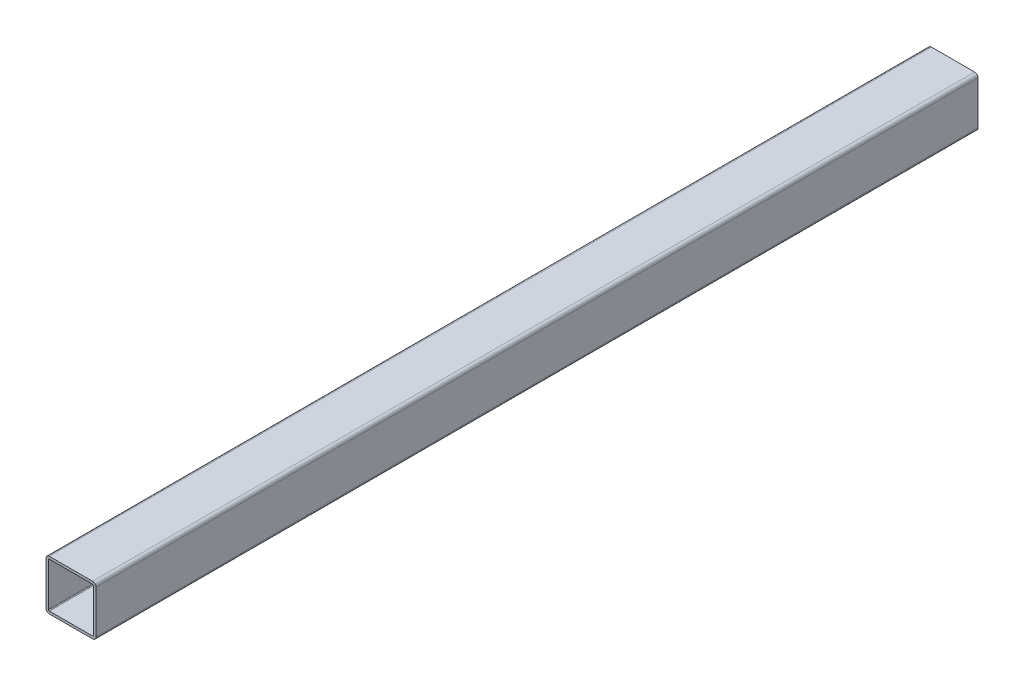
ISO-10303-21;
HEADER;
FILE_DESCRIPTION(('STEP AP214'),'2;1');
FILE_NAME('part.step','',(''),(''),'','','');
FILE_SCHEMA(('AUTOMOTIVE_DESIGN { 1 0 10303 214 1 1 1 1 }'));
ENDSEC;
DATA;
#1=APPLICATION_CONTEXT('core data for automotive mechanical design processes');
#2=APPLICATION_PROTOCOL_DEFINITION('international standard','automotive_design',2000,#1);
#3=PRODUCT_CONTEXT('',#1,'mechanical');
#4=PRODUCT('Part','Part','',(#3));
#5=PRODUCT_RELATED_PRODUCT_CATEGORY('part','',(#4));
#6=PRODUCT_DEFINITION_FORMATION('','',#4);
#7=PRODUCT_DEFINITION_CONTEXT('part definition',#1,'design');
#8=PRODUCT_DEFINITION('design','',#6,#7);
#9=PRODUCT_DEFINITION_SHAPE('','',#8);
#10=(LENGTH_UNIT() NAMED_UNIT(*) SI_UNIT(.MILLI.,.METRE.));
#11=(NAMED_UNIT(*) PLANE_ANGLE_UNIT() SI_UNIT($,.RADIAN.));
#12=(NAMED_UNIT(*) SI_UNIT($,.STERADIAN.) SOLID_ANGLE_UNIT());
#13=UNCERTAINTY_MEASURE_WITH_UNIT(LENGTH_MEASURE(1.E-05),#10,'distance_accuracy_value','');
#14=(GEOMETRIC_REPRESENTATION_CONTEXT(3) GLOBAL_UNCERTAINTY_ASSIGNED_CONTEXT((#13)) GLOBAL_UNIT_ASSIGNED_CONTEXT((#10,
#11,#12)) REPRESENTATION_CONTEXT('',''));
#15=CARTESIAN_POINT('',(0.,0.,0.));
#16=DIRECTION('',(0.,0.,1.));
#17=DIRECTION('',(1.,0.,0.));
#18=AXIS2_PLACEMENT_3D('',#15,#16,#17);
#19=CARTESIAN_POINT('',(2.,2.,530.));
#20=DIRECTION('',(0.,0.,1.));
#21=DIRECTION('',(1.,0.,0.));
#22=AXIS2_PLACEMENT_3D('',#19,#20,#21);
#23=PLANE('',#22);
#24=CARTESIAN_POINT('',(2.,2.,530.));
#25=DIRECTION('',(0.,0.,1.));
#26=DIRECTION('',(1.,0.,0.));
#27=AXIS2_PLACEMENT_3D('',#24,#25,#26);
#28=CIRCLE('',#27,2.);
#29=CARTESIAN_POINT('',(0.,2.00000000000001,530.));
#30=VERTEX_POINT('',#29);
#31=CARTESIAN_POINT('',(2.00000000000001,0.,530.));
#32=VERTEX_POINT('',#31);
#33=EDGE_CURVE('E263',#30,#32,#28,.T.);
#34=ORIENTED_EDGE('',*,*,#33,.T.);
#35=DIRECTION('',(1.,0.,0.));
#36=VECTOR('',#35,1.);
#37=CARTESIAN_POINT('',(2.00000000000001,0.,530.));
#38=LINE('',#37,#36);
#39=CARTESIAN_POINT('',(28.,0.,530.));
#40=VERTEX_POINT('',#39);
#41=EDGE_CURVE('E266',#32,#40,#38,.T.);
#42=ORIENTED_EDGE('',*,*,#41,.T.);
#43=CARTESIAN_POINT('',(28.,2.,530.));
#44=DIRECTION('',(0.,0.,1.));
#45=DIRECTION('',(-1.,0.,0.));
#46=AXIS2_PLACEMENT_3D('',#43,#44,#45);
#47=CIRCLE('',#46,2.);
#48=CARTESIAN_POINT('',(30.,2.00000000000001,530.));
#49=VERTEX_POINT('',#48);
#50=EDGE_CURVE('E269',#40,#49,#47,.T.);
#51=ORIENTED_EDGE('',*,*,#50,.T.);
#52=DIRECTION('',(0.,1.,0.));
#53=VECTOR('',#52,1.);
#54=CARTESIAN_POINT('',(30.,2.00000000000001,530.));
#55=LINE('',#54,#53);
#56=CARTESIAN_POINT('',(30.,28.,530.));
#57=VERTEX_POINT('',#56);
#58=EDGE_CURVE('E271',#49,#57,#55,.T.);
#59=ORIENTED_EDGE('',*,*,#58,.T.);
#60=CARTESIAN_POINT('',(28.,28.,530.));
#61=DIRECTION('',(0.,0.,1.));
#62=DIRECTION('',(-1.,0.,0.));
#63=AXIS2_PLACEMENT_3D('',#60,#61,#62);
#64=CIRCLE('',#63,2.);
#65=CARTESIAN_POINT('',(28.,30.,530.));
#66=VERTEX_POINT('',#65);
#67=EDGE_CURVE('E273',#57,#66,#64,.T.);
#68=ORIENTED_EDGE('',*,*,#67,.T.);
#69=DIRECTION('',(-1.,0.,0.));
#70=VECTOR('',#69,1.);
#71=CARTESIAN_POINT('',(2.00000000000001,30.,530.));
#72=LINE('',#71,#70);
#73=CARTESIAN_POINT('',(2.00000000000001,30.,530.));
#74=VERTEX_POINT('',#73);
#75=EDGE_CURVE('E275',#66,#74,#72,.T.);
#76=ORIENTED_EDGE('',*,*,#75,.T.);
#77=CARTESIAN_POINT('',(2.,28.,530.));
#78=DIRECTION('',(0.,0.,1.));
#79=DIRECTION('',(1.,0.,0.));
#80=AXIS2_PLACEMENT_3D('',#77,#78,#79);
#81=CIRCLE('',#80,2.);
#82=CARTESIAN_POINT('',(0.,28.,530.));
#83=VERTEX_POINT('',#82);
#84=EDGE_CURVE('E277',#74,#83,#81,.T.);
#85=ORIENTED_EDGE('',*,*,#84,.T.);
#86=DIRECTION('',(0.,-1.,0.));
#87=VECTOR('',#86,1.);
#88=CARTESIAN_POINT('',(0.,2.00000000000001,530.));
#89=LINE('',#88,#87);
#90=EDGE_CURVE('E279',#83,#30,#89,.T.);
#91=ORIENTED_EDGE('',*,*,#90,.T.);
#92=EDGE_LOOP('',(#34,#42,#51,#59,#68,#76,#85,#91));
#93=FACE_BOUND('',#92,.T.);
#94=DIRECTION('',(1.,0.,0.));
#95=VECTOR('',#94,1.);
#96=CARTESIAN_POINT('',(2.00000000000001,1.5,530.));
#97=LINE('',#96,#95);
#98=CARTESIAN_POINT('',(2.00000000000001,1.5,530.));
#99=VERTEX_POINT('',#98);
#100=CARTESIAN_POINT('',(28.,1.5,530.));
#101=VERTEX_POINT('',#100);
#102=EDGE_CURVE('E206',#99,#101,#97,.T.);
#103=ORIENTED_EDGE('',*,*,#102,.F.);
#104=CARTESIAN_POINT('',(2.,2.,530.));
#105=DIRECTION('',(0.,0.,1.));
#106=DIRECTION('',(1.,0.,0.));
#107=AXIS2_PLACEMENT_3D('',#104,#105,#106);
#108=CIRCLE('',#107,0.5);
#109=CARTESIAN_POINT('',(1.5,2.00000000000001,530.));
#110=VERTEX_POINT('',#109);
#111=EDGE_CURVE('E198',#110,#99,#108,.T.);
#112=ORIENTED_EDGE('',*,*,#111,.F.);
#113=DIRECTION('',(0.,-1.,0.));
#114=VECTOR('',#113,1.);
#115=CARTESIAN_POINT('',(1.5,2.00000000000001,530.));
#116=LINE('',#115,#114);
#117=CARTESIAN_POINT('',(1.5,28.,530.));
#118=VERTEX_POINT('',#117);
#119=EDGE_CURVE('E231',#118,#110,#116,.T.);
#120=ORIENTED_EDGE('',*,*,#119,.F.);
#121=CARTESIAN_POINT('',(2.,28.,530.));
#122=DIRECTION('',(0.,0.,1.));
#123=DIRECTION('',(1.,0.,0.));
#124=AXIS2_PLACEMENT_3D('',#121,#122,#123);
#125=CIRCLE('',#124,0.500000000000001);
#126=CARTESIAN_POINT('',(2.00000000000001,28.5,530.));
#127=VERTEX_POINT('',#126);
#128=EDGE_CURVE('E229',#127,#118,#125,.T.);
#129=ORIENTED_EDGE('',*,*,#128,.F.);
#130=DIRECTION('',(-1.,0.,0.));
#131=VECTOR('',#130,1.);
#132=CARTESIAN_POINT('',(2.00000000000001,28.5,530.));
#133=LINE('',#132,#131);
#134=CARTESIAN_POINT('',(28.,28.5,530.));
#135=VERTEX_POINT('',#134);
#136=EDGE_CURVE('E227',#135,#127,#133,.T.);
#137=ORIENTED_EDGE('',*,*,#136,.F.);
#138=CARTESIAN_POINT('',(28.,28.,530.));
#139=DIRECTION('',(0.,0.,1.));
#140=DIRECTION('',(1.,0.,0.));
#141=AXIS2_PLACEMENT_3D('',#138,#139,#140);
#142=CIRCLE('',#141,0.500000000000002);
#143=CARTESIAN_POINT('',(28.5,28.,530.));
#144=VERTEX_POINT('',#143);
#145=EDGE_CURVE('E225',#144,#135,#142,.T.);
#146=ORIENTED_EDGE('',*,*,#145,.F.);
#147=DIRECTION('',(0.,1.,0.));
#148=VECTOR('',#147,1.);
#149=CARTESIAN_POINT('',(28.5,2.00000000000001,530.));
#150=LINE('',#149,#148);
#151=CARTESIAN_POINT('',(28.5,2.,530.));
#152=VERTEX_POINT('',#151);
#153=EDGE_CURVE('E221',#152,#144,#150,.T.);
#154=ORIENTED_EDGE('',*,*,#153,.F.);
#155=CARTESIAN_POINT('',(28.,2.,530.));
#156=DIRECTION('',(0.,0.,1.));
#157=DIRECTION('',(1.,0.,0.));
#158=AXIS2_PLACEMENT_3D('',#155,#156,#157);
#159=CIRCLE('',#158,0.500000000000001);
#160=EDGE_CURVE('E219',#101,#152,#159,.T.);
#161=ORIENTED_EDGE('',*,*,#160,.F.);
#162=EDGE_LOOP('',(#103,#112,#120,#129,#137,#146,#154,#161));
#163=FACE_BOUND('',#162,.T.);
#164=ADVANCED_FACE('F85',(#93,#163),#23,.T.);
#165=CARTESIAN_POINT('',(2.,2.,0.));
#166=DIRECTION('',(0.,0.,1.));
#167=DIRECTION('',(1.,0.,0.));
#168=AXIS2_PLACEMENT_3D('',#165,#166,#167);
#169=PLANE('',#168);
#170=CARTESIAN_POINT('',(2.,2.,0.));
#171=DIRECTION('',(0.,0.,1.));
#172=DIRECTION('',(1.,0.,0.));
#173=AXIS2_PLACEMENT_3D('',#170,#171,#172);
#174=CIRCLE('',#173,2.);
#175=CARTESIAN_POINT('',(0.,2.00000000000001,0.));
#176=VERTEX_POINT('',#175);
#177=CARTESIAN_POINT('',(2.00000000000001,0.,0.));
#178=VERTEX_POINT('',#177);
#179=EDGE_CURVE('E214',#176,#178,#174,.T.);
#180=ORIENTED_EDGE('',*,*,#179,.F.);
#181=DIRECTION('',(0.,-1.,0.));
#182=VECTOR('',#181,1.);
#183=CARTESIAN_POINT('',(0.,2.00000000000001,0.));
#184=LINE('',#183,#182);
#185=CARTESIAN_POINT('',(0.,28.,0.));
#186=VERTEX_POINT('',#185);
#187=EDGE_CURVE('E267',#186,#176,#184,.T.);
#188=ORIENTED_EDGE('',*,*,#187,.F.);
#189=CARTESIAN_POINT('',(2.,28.,0.));
#190=DIRECTION('',(0.,0.,1.));
#191=DIRECTION('',(1.,0.,0.));
#192=AXIS2_PLACEMENT_3D('',#189,#190,#191);
#193=CIRCLE('',#192,2.);
#194=CARTESIAN_POINT('',(2.00000000000001,30.,0.));
#195=VERTEX_POINT('',#194);
#196=EDGE_CURVE('E294',#195,#186,#193,.T.);
#197=ORIENTED_EDGE('',*,*,#196,.F.);
#198=DIRECTION('',(-1.,0.,0.));
#199=VECTOR('',#198,1.);
#200=CARTESIAN_POINT('',(2.00000000000001,30.,0.));
#201=LINE('',#200,#199);
#202=CARTESIAN_POINT('',(28.,30.,0.));
#203=VERTEX_POINT('',#202);
#204=EDGE_CURVE('E292',#203,#195,#201,.T.);
#205=ORIENTED_EDGE('',*,*,#204,.F.);
#206=CARTESIAN_POINT('',(28.,28.,0.));
#207=DIRECTION('',(0.,0.,1.));
#208=DIRECTION('',(-1.,0.,0.));
#209=AXIS2_PLACEMENT_3D('',#206,#207,#208);
#210=CIRCLE('',#209,2.);
#211=CARTESIAN_POINT('',(30.,28.,0.));
#212=VERTEX_POINT('',#211);
#213=EDGE_CURVE('E290',#212,#203,#210,.T.);
#214=ORIENTED_EDGE('',*,*,#213,.F.);
#215=DIRECTION('',(0.,1.,0.));
#216=VECTOR('',#215,1.);
#217=CARTESIAN_POINT('',(30.,2.00000000000001,0.));
#218=LINE('',#217,#216);
#219=CARTESIAN_POINT('',(30.,2.00000000000001,0.));
#220=VERTEX_POINT('',#219);
#221=EDGE_CURVE('E288',#220,#212,#218,.T.);
#222=ORIENTED_EDGE('',*,*,#221,.F.);
#223=CARTESIAN_POINT('',(28.,2.,0.));
#224=DIRECTION('',(0.,0.,1.));
#225=DIRECTION('',(-1.,0.,0.));
#226=AXIS2_PLACEMENT_3D('',#223,#224,#225);
#227=CIRCLE('',#226,2.);
#228=CARTESIAN_POINT('',(28.,0.,0.));
#229=VERTEX_POINT('',#228);
#230=EDGE_CURVE('E286',#229,#220,#227,.T.);
#231=ORIENTED_EDGE('',*,*,#230,.F.);
#232=DIRECTION('',(1.,0.,0.));
#233=VECTOR('',#232,1.);
#234=CARTESIAN_POINT('',(2.00000000000001,0.,0.));
#235=LINE('',#234,#233);
#236=EDGE_CURVE('E284',#178,#229,#235,.T.);
#237=ORIENTED_EDGE('',*,*,#236,.F.);
#238=EDGE_LOOP('',(#180,#188,#197,#205,#214,#222,#231,#237));
#239=FACE_BOUND('',#238,.T.);
#240=CARTESIAN_POINT('',(2.,2.,0.));
#241=DIRECTION('',(0.,0.,1.));
#242=DIRECTION('',(1.,0.,0.));
#243=AXIS2_PLACEMENT_3D('',#240,#241,#242);
#244=CIRCLE('',#243,0.5);
#245=CARTESIAN_POINT('',(1.5,2.00000000000001,0.));
#246=VERTEX_POINT('',#245);
#247=CARTESIAN_POINT('',(2.00000000000001,1.5,0.));
#248=VERTEX_POINT('',#247);
#249=EDGE_CURVE('E108',#246,#248,#244,.T.);
#250=ORIENTED_EDGE('',*,*,#249,.T.);
#251=DIRECTION('',(1.,0.,0.));
#252=VECTOR('',#251,1.);
#253=CARTESIAN_POINT('',(2.00000000000001,1.5,0.));
#254=LINE('',#253,#252);
#255=CARTESIAN_POINT('',(28.,1.5,0.));
#256=VERTEX_POINT('',#255);
#257=EDGE_CURVE('E213',#248,#256,#254,.T.);
#258=ORIENTED_EDGE('',*,*,#257,.T.);
#259=CARTESIAN_POINT('',(28.,2.,0.));
#260=DIRECTION('',(0.,0.,1.));
#261=DIRECTION('',(1.,0.,0.));
#262=AXIS2_PLACEMENT_3D('',#259,#260,#261);
#263=CIRCLE('',#262,0.500000000000001);
#264=CARTESIAN_POINT('',(28.5,2.,0.));
#265=VERTEX_POINT('',#264);
#266=EDGE_CURVE('E235',#256,#265,#263,.T.);
#267=ORIENTED_EDGE('',*,*,#266,.T.);
#268=DIRECTION('',(0.,1.,0.));
#269=VECTOR('',#268,1.);
#270=CARTESIAN_POINT('',(28.5,2.00000000000001,0.));
#271=LINE('',#270,#269);
#272=CARTESIAN_POINT('',(28.5,28.,0.));
#273=VERTEX_POINT('',#272);
#274=EDGE_CURVE('E238',#265,#273,#271,.T.);
#275=ORIENTED_EDGE('',*,*,#274,.T.);
#276=CARTESIAN_POINT('',(28.,28.,0.));
#277=DIRECTION('',(0.,0.,1.));
#278=DIRECTION('',(1.,0.,0.));
#279=AXIS2_PLACEMENT_3D('',#276,#277,#278);
#280=CIRCLE('',#279,0.500000000000002);
#281=CARTESIAN_POINT('',(28.,28.5,0.));
#282=VERTEX_POINT('',#281);
#283=EDGE_CURVE('E241',#273,#282,#280,.T.);
#284=ORIENTED_EDGE('',*,*,#283,.T.);
#285=DIRECTION('',(-1.,0.,0.));
#286=VECTOR('',#285,1.);
#287=CARTESIAN_POINT('',(2.00000000000001,28.5,0.));
#288=LINE('',#287,#286);
#289=CARTESIAN_POINT('',(2.00000000000001,28.5,0.));
#290=VERTEX_POINT('',#289);
#291=EDGE_CURVE('E244',#282,#290,#288,.T.);
#292=ORIENTED_EDGE('',*,*,#291,.T.);
#293=CARTESIAN_POINT('',(2.,28.,0.));
#294=DIRECTION('',(0.,0.,1.));
#295=DIRECTION('',(1.,0.,0.));
#296=AXIS2_PLACEMENT_3D('',#293,#294,#295);
#297=CIRCLE('',#296,0.500000000000001);
#298=CARTESIAN_POINT('',(1.5,28.,0.));
#299=VERTEX_POINT('',#298);
#300=EDGE_CURVE('E247',#290,#299,#297,.T.);
#301=ORIENTED_EDGE('',*,*,#300,.T.);
#302=DIRECTION('',(0.,-1.,0.));
#303=VECTOR('',#302,1.);
#304=CARTESIAN_POINT('',(1.5,2.00000000000001,0.));
#305=LINE('',#304,#303);
#306=EDGE_CURVE('E207',#299,#246,#305,.T.);
#307=ORIENTED_EDGE('',*,*,#306,.T.);
#308=EDGE_LOOP('',(#250,#258,#267,#275,#284,#292,#301,#307));
#309=FACE_BOUND('',#308,.T.);
#310=ADVANCED_FACE('F324',(#239,#309),#169,.F.);
#311=CARTESIAN_POINT('',(2.,2.,530.));
#312=DIRECTION('',(0.,0.,-1.));
#313=DIRECTION('',(-1.,0.,0.));
#314=AXIS2_PLACEMENT_3D('',#311,#312,#313);
#315=CYLINDRICAL_SURFACE('',#314,2.);
#316=ORIENTED_EDGE('',*,*,#179,.T.);
#317=DIRECTION('',(0.,0.,-1.));
#318=VECTOR('',#317,1.);
#319=CARTESIAN_POINT('',(2.00000000000001,0.,530.));
#320=LINE('',#319,#318);
#321=EDGE_CURVE('E12',#32,#178,#320,.T.);
#322=ORIENTED_EDGE('',*,*,#321,.F.);
#323=ORIENTED_EDGE('',*,*,#33,.F.);
#324=DIRECTION('',(0.,0.,-1.));
#325=VECTOR('',#324,1.);
#326=CARTESIAN_POINT('',(0.,2.00000000000001,530.));
#327=LINE('',#326,#325);
#328=EDGE_CURVE('E281',#30,#176,#327,.T.);
#329=ORIENTED_EDGE('',*,*,#328,.T.);
#330=EDGE_LOOP('',(#316,#322,#323,#329));
#331=FACE_BOUND('',#330,.T.);
#332=ADVANCED_FACE('F87',(#331),#315,.T.);
#333=CARTESIAN_POINT('',(2.00000000000001,0.,530.));
#334=DIRECTION('',(0.,1.,0.));
#335=DIRECTION('',(0.,0.,1.));
#336=AXIS2_PLACEMENT_3D('',#333,#334,#335);
#337=PLANE('',#336);
#338=ORIENTED_EDGE('',*,*,#236,.T.);
#339=DIRECTION('',(0.,0.,-1.));
#340=VECTOR('',#339,1.);
#341=CARTESIAN_POINT('',(28.,0.,530.));
#342=LINE('',#341,#340);
#343=EDGE_CURVE('E93',#40,#229,#342,.T.);
#344=ORIENTED_EDGE('',*,*,#343,.F.);
#345=ORIENTED_EDGE('',*,*,#41,.F.);
#346=ORIENTED_EDGE('',*,*,#321,.T.);
#347=EDGE_LOOP('',(#338,#344,#345,#346));
#348=FACE_BOUND('',#347,.T.);
#349=ADVANCED_FACE('F341',(#348),#337,.F.);
#350=CARTESIAN_POINT('',(28.,2.,530.));
#351=DIRECTION('',(0.,0.,-1.));
#352=DIRECTION('',(-1.,0.,0.));
#353=AXIS2_PLACEMENT_3D('',#350,#351,#352);
#354=CYLINDRICAL_SURFACE('',#353,2.);
#355=ORIENTED_EDGE('',*,*,#230,.T.);
#356=DIRECTION('',(0.,0.,-1.));
#357=VECTOR('',#356,1.);
#358=CARTESIAN_POINT('',(30.,2.00000000000001,530.));
#359=LINE('',#358,#357);
#360=EDGE_CURVE('E311',#49,#220,#359,.T.);
#361=ORIENTED_EDGE('',*,*,#360,.F.);
#362=ORIENTED_EDGE('',*,*,#50,.F.);
#363=ORIENTED_EDGE('',*,*,#343,.T.);
#364=EDGE_LOOP('',(#355,#361,#362,#363));
#365=FACE_BOUND('',#364,.T.);
#366=ADVANCED_FACE('F318',(#365),#354,.T.);
#367=CARTESIAN_POINT('',(30.,2.00000000000001,530.));
#368=DIRECTION('',(-1.,0.,0.));
#369=DIRECTION('',(0.,0.,1.));
#370=AXIS2_PLACEMENT_3D('',#367,#368,#369);
#371=PLANE('',#370);
#372=ORIENTED_EDGE('',*,*,#221,.T.);
#373=DIRECTION('',(0.,0.,-1.));
#374=VECTOR('',#373,1.);
#375=CARTESIAN_POINT('',(30.,28.,530.));
#376=LINE('',#375,#374);
#377=EDGE_CURVE('E308',#57,#212,#376,.T.);
#378=ORIENTED_EDGE('',*,*,#377,.F.);
#379=ORIENTED_EDGE('',*,*,#58,.F.);
#380=ORIENTED_EDGE('',*,*,#360,.T.);
#381=EDGE_LOOP('',(#372,#378,#379,#380));
#382=FACE_BOUND('',#381,.T.);
#383=ADVANCED_FACE('F330',(#382),#371,.F.);
#384=CARTESIAN_POINT('',(28.,28.,530.));
#385=DIRECTION('',(0.,0.,-1.));
#386=DIRECTION('',(-1.,0.,0.));
#387=AXIS2_PLACEMENT_3D('',#384,#385,#386);
#388=CYLINDRICAL_SURFACE('',#387,2.);
#389=ORIENTED_EDGE('',*,*,#213,.T.);
#390=DIRECTION('',(0.,0.,-1.));
#391=VECTOR('',#390,1.);
#392=CARTESIAN_POINT('',(28.,30.,530.));
#393=LINE('',#392,#391);
#394=EDGE_CURVE('E305',#66,#203,#393,.T.);
#395=ORIENTED_EDGE('',*,*,#394,.F.);
#396=ORIENTED_EDGE('',*,*,#67,.F.);
#397=ORIENTED_EDGE('',*,*,#377,.T.);
#398=EDGE_LOOP('',(#389,#395,#396,#397));
#399=FACE_BOUND('',#398,.T.);
#400=ADVANCED_FACE('F334',(#399),#388,.T.);
#401=CARTESIAN_POINT('',(2.00000000000001,30.,530.));
#402=DIRECTION('',(0.,-1.,0.));
#403=DIRECTION('',(0.,0.,-1.));
#404=AXIS2_PLACEMENT_3D('',#401,#402,#403);
#405=PLANE('',#404);
#406=ORIENTED_EDGE('',*,*,#204,.T.);
#407=DIRECTION('',(0.,0.,-1.));
#408=VECTOR('',#407,1.);
#409=CARTESIAN_POINT('',(2.00000000000001,30.,530.));
#410=LINE('',#409,#408);
#411=EDGE_CURVE('E302',#74,#195,#410,.T.);
#412=ORIENTED_EDGE('',*,*,#411,.F.);
#413=ORIENTED_EDGE('',*,*,#75,.F.);
#414=ORIENTED_EDGE('',*,*,#394,.T.);
#415=EDGE_LOOP('',(#406,#412,#413,#414));
#416=FACE_BOUND('',#415,.T.);
#417=ADVANCED_FACE('F354',(#416),#405,.F.);
#418=CARTESIAN_POINT('',(2.,28.,530.));
#419=DIRECTION('',(0.,0.,-1.));
#420=DIRECTION('',(-1.,0.,0.));
#421=AXIS2_PLACEMENT_3D('',#418,#419,#420);
#422=CYLINDRICAL_SURFACE('',#421,2.);
#423=ORIENTED_EDGE('',*,*,#196,.T.);
#424=DIRECTION('',(0.,0.,-1.));
#425=VECTOR('',#424,1.);
#426=CARTESIAN_POINT('',(0.,28.,530.));
#427=LINE('',#426,#425);
#428=EDGE_CURVE('E299',#83,#186,#427,.T.);
#429=ORIENTED_EDGE('',*,*,#428,.F.);
#430=ORIENTED_EDGE('',*,*,#84,.F.);
#431=ORIENTED_EDGE('',*,*,#411,.T.);
#432=EDGE_LOOP('',(#423,#429,#430,#431));
#433=FACE_BOUND('',#432,.T.);
#434=ADVANCED_FACE('F352',(#433),#422,.T.);
#435=CARTESIAN_POINT('',(0.,2.00000000000001,530.));
#436=DIRECTION('',(1.,0.,0.));
#437=DIRECTION('',(0.,0.,-1.));
#438=AXIS2_PLACEMENT_3D('',#435,#436,#437);
#439=PLANE('',#438);
#440=ORIENTED_EDGE('',*,*,#187,.T.);
#441=ORIENTED_EDGE('',*,*,#328,.F.);
#442=ORIENTED_EDGE('',*,*,#90,.F.);
#443=ORIENTED_EDGE('',*,*,#428,.T.);
#444=EDGE_LOOP('',(#440,#441,#442,#443));
#445=FACE_BOUND('',#444,.T.);
#446=ADVANCED_FACE('F347',(#445),#439,.F.);
#447=CARTESIAN_POINT('',(2.,2.,530.));
#448=DIRECTION('',(0.,0.,-1.));
#449=DIRECTION('',(-1.,0.,0.));
#450=AXIS2_PLACEMENT_3D('',#447,#448,#449);
#451=CYLINDRICAL_SURFACE('',#450,0.5);
#452=ORIENTED_EDGE('',*,*,#249,.F.);
#453=DIRECTION('',(0.,0.,-1.));
#454=VECTOR('',#453,1.);
#455=CARTESIAN_POINT('',(1.5,2.00000000000001,530.));
#456=LINE('',#455,#454);
#457=EDGE_CURVE('E202',#110,#246,#456,.T.);
#458=ORIENTED_EDGE('',*,*,#457,.F.);
#459=ORIENTED_EDGE('',*,*,#111,.T.);
#460=DIRECTION('',(0.,0.,-1.));
#461=VECTOR('',#460,1.);
#462=CARTESIAN_POINT('',(2.00000000000001,1.5,530.));
#463=LINE('',#462,#461);
#464=EDGE_CURVE('E201',#99,#248,#463,.T.);
#465=ORIENTED_EDGE('',*,*,#464,.T.);
#466=EDGE_LOOP('',(#452,#458,#459,#465));
#467=FACE_BOUND('',#466,.T.);
#468=ADVANCED_FACE('F200',(#467),#451,.F.);
#469=CARTESIAN_POINT('',(2.00000000000001,1.5,530.));
#470=DIRECTION('',(0.,1.,0.));
#471=DIRECTION('',(0.,0.,1.));
#472=AXIS2_PLACEMENT_3D('',#469,#470,#471);
#473=PLANE('',#472);
#474=ORIENTED_EDGE('',*,*,#257,.F.);
#475=ORIENTED_EDGE('',*,*,#464,.F.);
#476=ORIENTED_EDGE('',*,*,#102,.T.);
#477=DIRECTION('',(0.,0.,-1.));
#478=VECTOR('',#477,1.);
#479=CARTESIAN_POINT('',(28.,1.5,530.));
#480=LINE('',#479,#478);
#481=EDGE_CURVE('E215',#101,#256,#480,.T.);
#482=ORIENTED_EDGE('',*,*,#481,.T.);
#483=EDGE_LOOP('',(#474,#475,#476,#482));
#484=FACE_BOUND('',#483,.T.);
#485=ADVANCED_FACE('F210',(#484),#473,.T.);
#486=CARTESIAN_POINT('',(28.,2.,530.));
#487=DIRECTION('',(0.,0.,-1.));
#488=DIRECTION('',(-1.,0.,0.));
#489=AXIS2_PLACEMENT_3D('',#486,#487,#488);
#490=CYLINDRICAL_SURFACE('',#489,0.500000000000001);
#491=ORIENTED_EDGE('',*,*,#266,.F.);
#492=ORIENTED_EDGE('',*,*,#481,.F.);
#493=ORIENTED_EDGE('',*,*,#160,.T.);
#494=DIRECTION('',(0.,0.,-1.));
#495=VECTOR('',#494,1.);
#496=CARTESIAN_POINT('',(28.5,2.,530.));
#497=LINE('',#496,#495);
#498=EDGE_CURVE('E260',#152,#265,#497,.T.);
#499=ORIENTED_EDGE('',*,*,#498,.T.);
#500=EDGE_LOOP('',(#491,#492,#493,#499));
#501=FACE_BOUND('',#500,.T.);
#502=ADVANCED_FACE('F379',(#501),#490,.F.);
#503=CARTESIAN_POINT('',(28.5,2.00000000000001,530.));
#504=DIRECTION('',(-1.,0.,0.));
#505=DIRECTION('',(0.,0.,1.));
#506=AXIS2_PLACEMENT_3D('',#503,#504,#505);
#507=PLANE('',#506);
#508=ORIENTED_EDGE('',*,*,#274,.F.);
#509=ORIENTED_EDGE('',*,*,#498,.F.);
#510=ORIENTED_EDGE('',*,*,#153,.T.);
#511=DIRECTION('',(0.,0.,-1.));
#512=VECTOR('',#511,1.);
#513=CARTESIAN_POINT('',(28.5,28.,530.));
#514=LINE('',#513,#512);
#515=EDGE_CURVE('E258',#144,#273,#514,.T.);
#516=ORIENTED_EDGE('',*,*,#515,.T.);
#517=EDGE_LOOP('',(#508,#509,#510,#516));
#518=FACE_BOUND('',#517,.T.);
#519=ADVANCED_FACE('F383',(#518),#507,.T.);
#520=CARTESIAN_POINT('',(28.,28.,530.));
#521=DIRECTION('',(0.,0.,-1.));
#522=DIRECTION('',(-1.,0.,0.));
#523=AXIS2_PLACEMENT_3D('',#520,#521,#522);
#524=CYLINDRICAL_SURFACE('',#523,0.500000000000002);
#525=ORIENTED_EDGE('',*,*,#283,.F.);
#526=ORIENTED_EDGE('',*,*,#515,.F.);
#527=ORIENTED_EDGE('',*,*,#145,.T.);
#528=DIRECTION('',(0.,0.,-1.));
#529=VECTOR('',#528,1.);
#530=CARTESIAN_POINT('',(28.,28.5,530.));
#531=LINE('',#530,#529);
#532=EDGE_CURVE('E256',#135,#282,#531,.T.);
#533=ORIENTED_EDGE('',*,*,#532,.T.);
#534=EDGE_LOOP('',(#525,#526,#527,#533));
#535=FACE_BOUND('',#534,.T.);
#536=ADVANCED_FACE('F389',(#535),#524,.F.);
#537=CARTESIAN_POINT('',(2.00000000000001,28.5,530.));
#538=DIRECTION('',(0.,-1.,0.));
#539=DIRECTION('',(0.,0.,-1.));
#540=AXIS2_PLACEMENT_3D('',#537,#538,#539);
#541=PLANE('',#540);
#542=ORIENTED_EDGE('',*,*,#291,.F.);
#543=ORIENTED_EDGE('',*,*,#532,.F.);
#544=ORIENTED_EDGE('',*,*,#136,.T.);
#545=DIRECTION('',(0.,0.,-1.));
#546=VECTOR('',#545,1.);
#547=CARTESIAN_POINT('',(2.00000000000001,28.5,530.));
#548=LINE('',#547,#546);
#549=EDGE_CURVE('E254',#127,#290,#548,.T.);
#550=ORIENTED_EDGE('',*,*,#549,.T.);
#551=EDGE_LOOP('',(#542,#543,#544,#550));
#552=FACE_BOUND('',#551,.T.);
#553=ADVANCED_FACE('F393',(#552),#541,.T.);
#554=CARTESIAN_POINT('',(2.,28.,530.));
#555=DIRECTION('',(0.,0.,-1.));
#556=DIRECTION('',(-1.,0.,0.));
#557=AXIS2_PLACEMENT_3D('',#554,#555,#556);
#558=CYLINDRICAL_SURFACE('',#557,0.500000000000001);
#559=ORIENTED_EDGE('',*,*,#300,.F.);
#560=ORIENTED_EDGE('',*,*,#549,.F.);
#561=ORIENTED_EDGE('',*,*,#128,.T.);
#562=DIRECTION('',(0.,0.,-1.));
#563=VECTOR('',#562,1.);
#564=CARTESIAN_POINT('',(1.5,28.,530.));
#565=LINE('',#564,#563);
#566=EDGE_CURVE('E100',#118,#299,#565,.T.);
#567=ORIENTED_EDGE('',*,*,#566,.T.);
#568=EDGE_LOOP('',(#559,#560,#561,#567));
#569=FACE_BOUND('',#568,.T.);
#570=ADVANCED_FACE('F397',(#569),#558,.F.);
#571=CARTESIAN_POINT('',(1.5,2.00000000000001,530.));
#572=DIRECTION('',(1.,0.,0.));
#573=DIRECTION('',(0.,0.,-1.));
#574=AXIS2_PLACEMENT_3D('',#571,#572,#573);
#575=PLANE('',#574);
#576=ORIENTED_EDGE('',*,*,#306,.F.);
#577=ORIENTED_EDGE('',*,*,#566,.F.);
#578=ORIENTED_EDGE('',*,*,#119,.T.);
#579=ORIENTED_EDGE('',*,*,#457,.T.);
#580=EDGE_LOOP('',(#576,#577,#578,#579));
#581=FACE_BOUND('',#580,.T.);
#582=ADVANCED_FACE('F401',(#581),#575,.T.);
#583=CLOSED_SHELL('',(#164,#310,#332,#349,#366,#383,#400,#417,#434,#446,#468,#485,#502,#519,
#536,#553,#570,#582));
#584=MANIFOLD_SOLID_BREP('B2',#583);
#585=ADVANCED_BREP_SHAPE_REPRESENTATION('',(#18,#584),#14);
#586=SHAPE_DEFINITION_REPRESENTATION(#9,#585);
ENDSEC;
END-ISO-10303-21;
